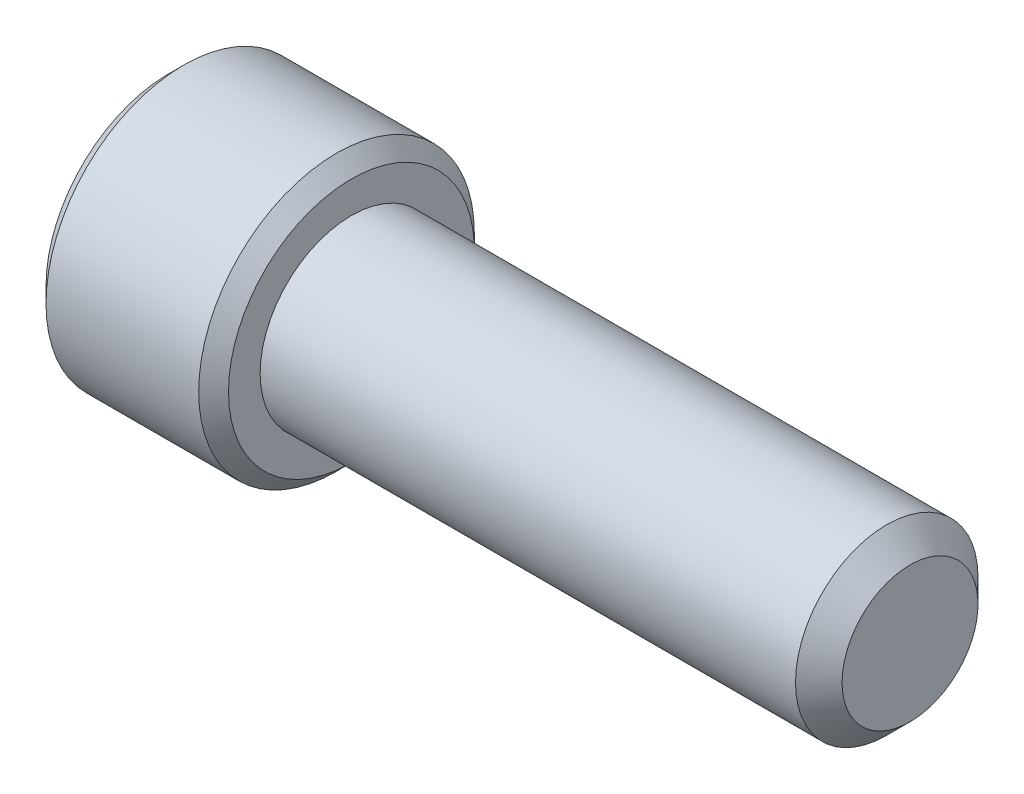
ISO-10303-21;
HEADER;
FILE_DESCRIPTION(('STEP AP214'),'2;1');
FILE_NAME('part.step','',(''),(''),'','','');
FILE_SCHEMA(('AUTOMOTIVE_DESIGN { 1 0 10303 214 1 1 1 1 }'));
ENDSEC;
DATA;
#1=APPLICATION_CONTEXT('core data for automotive mechanical design processes');
#2=APPLICATION_PROTOCOL_DEFINITION('international standard','automotive_design',2000,#1);
#3=PRODUCT_CONTEXT('',#1,'mechanical');
#4=PRODUCT('Part','Part','',(#3));
#5=PRODUCT_RELATED_PRODUCT_CATEGORY('part','',(#4));
#6=PRODUCT_DEFINITION_FORMATION('','',#4);
#7=PRODUCT_DEFINITION_CONTEXT('part definition',#1,'design');
#8=PRODUCT_DEFINITION('design','',#6,#7);
#9=PRODUCT_DEFINITION_SHAPE('','',#8);
#10=(LENGTH_UNIT() NAMED_UNIT(*) SI_UNIT(.MILLI.,.METRE.));
#11=(NAMED_UNIT(*) PLANE_ANGLE_UNIT() SI_UNIT($,.RADIAN.));
#12=(NAMED_UNIT(*) SI_UNIT($,.STERADIAN.) SOLID_ANGLE_UNIT());
#13=UNCERTAINTY_MEASURE_WITH_UNIT(LENGTH_MEASURE(1.E-05),#10,'distance_accuracy_value','');
#14=(GEOMETRIC_REPRESENTATION_CONTEXT(3) GLOBAL_UNCERTAINTY_ASSIGNED_CONTEXT((#13)) GLOBAL_UNIT_ASSIGNED_CONTEXT((#10,
#11,#12)) REPRESENTATION_CONTEXT('',''));
#15=CARTESIAN_POINT('',(0.,0.,0.));
#16=DIRECTION('',(0.,0.,1.));
#17=DIRECTION('',(1.,0.,0.));
#18=AXIS2_PLACEMENT_3D('',#15,#16,#17);
#19=CARTESIAN_POINT('',(12.6365,0.,0.));
#20=DIRECTION('',(-1.,0.,0.));
#21=DIRECTION('',(0.,0.,1.));
#22=AXIS2_PLACEMENT_3D('',#19,#20,#21);
#23=PLANE('',#22);
#24=CARTESIAN_POINT('',(12.6365,0.,0.));
#25=DIRECTION('',(-1.,0.,0.));
#26=DIRECTION('',(0.,0.,1.));
#27=AXIS2_PLACEMENT_3D('',#24,#25,#26);
#28=CIRCLE('',#27,2.31775000002391);
#29=CARTESIAN_POINT('',(12.6365,0.,2.31775000002391));
#30=VERTEX_POINT('',#29);
#31=EDGE_CURVE('E11',#30,#30,#28,.T.);
#32=ORIENTED_EDGE('',*,*,#31,.F.);
#33=EDGE_LOOP('',(#32));
#34=FACE_BOUND('',#33,.T.);
#35=ADVANCED_FACE('F30',(#34),#23,.F.);
#36=CARTESIAN_POINT('',(12.6365,0.,0.));
#37=DIRECTION('',(-1.,0.,0.));
#38=DIRECTION('',(0.,0.,1.));
#39=AXIS2_PLACEMENT_3D('',#36,#37,#38);
#40=CONICAL_SURFACE('',#39,2.31775000002391,0.785398163397443);
#41=CARTESIAN_POINT('',(11.8427500000239,0.,0.));
#42=DIRECTION('',(-1.,0.,0.));
#43=DIRECTION('',(0.,0.,1.));
#44=AXIS2_PLACEMENT_3D('',#41,#42,#43);
#45=CIRCLE('',#44,3.11150000000002);
#46=CARTESIAN_POINT('',(11.8427500000239,0.,3.11150000000002));
#47=VERTEX_POINT('',#46);
#48=EDGE_CURVE('E37',#47,#47,#45,.T.);
#49=ORIENTED_EDGE('',*,*,#48,.F.);
#50=EDGE_LOOP('',(#49));
#51=FACE_BOUND('',#50,.T.);
#52=ORIENTED_EDGE('',*,*,#31,.T.);
#53=EDGE_LOOP('',(#52));
#54=FACE_BOUND('',#53,.T.);
#55=ADVANCED_FACE('F155',(#51,#54),#40,.T.);
#56=CARTESIAN_POINT('',(-124.874669814116,0.,0.));
#57=DIRECTION('',(-1.,0.,0.));
#58=DIRECTION('',(0.,0.,1.));
#59=AXIS2_PLACEMENT_3D('',#56,#57,#58);
#60=CYLINDRICAL_SURFACE('',#59,3.11150000000001);
#61=CARTESIAN_POINT('',(-6.4135,0.,0.));
#62=DIRECTION('',(-1.,0.,0.));
#63=DIRECTION('',(0.,0.,1.));
#64=AXIS2_PLACEMENT_3D('',#61,#62,#63);
#65=CIRCLE('',#64,3.11150000000001);
#66=CARTESIAN_POINT('',(-6.4135,0.,3.11150000000001));
#67=VERTEX_POINT('',#66);
#68=EDGE_CURVE('E148',#67,#67,#65,.T.);
#69=ORIENTED_EDGE('',*,*,#68,.F.);
#70=EDGE_LOOP('',(#69));
#71=FACE_BOUND('',#70,.T.);
#72=ORIENTED_EDGE('',*,*,#48,.T.);
#73=EDGE_LOOP('',(#72));
#74=FACE_BOUND('',#73,.T.);
#75=ADVANCED_FACE('F153',(#71,#74),#60,.T.);
#76=CARTESIAN_POINT('',(-6.4135,3.11150000000001,0.));
#77=DIRECTION('',(-1.,0.,0.));
#78=DIRECTION('',(0.,0.,1.));
#79=AXIS2_PLACEMENT_3D('',#76,#77,#78);
#80=PLANE('',#79);
#81=CARTESIAN_POINT('',(-6.4135,0.,0.));
#82=DIRECTION('',(-1.,0.,0.));
#83=DIRECTION('',(0.,0.,1.));
#84=AXIS2_PLACEMENT_3D('',#81,#82,#83);
#85=CIRCLE('',#84,4.191);
#86=CARTESIAN_POINT('',(-6.4135,0.,4.191));
#87=VERTEX_POINT('',#86);
#88=EDGE_CURVE('E145',#87,#87,#85,.T.);
#89=ORIENTED_EDGE('',*,*,#88,.F.);
#90=EDGE_LOOP('',(#89));
#91=FACE_BOUND('',#90,.T.);
#92=ORIENTED_EDGE('',*,*,#68,.T.);
#93=EDGE_LOOP('',(#92));
#94=FACE_BOUND('',#93,.T.);
#95=ADVANCED_FACE('F173',(#91,#94),#80,.F.);
#96=CARTESIAN_POINT('',(-6.4135,0.,0.));
#97=DIRECTION('',(-1.,0.,0.));
#98=DIRECTION('',(0.,0.,1.));
#99=AXIS2_PLACEMENT_3D('',#96,#97,#98);
#100=CONICAL_SURFACE('',#99,4.191,0.785398163397453);
#101=CARTESIAN_POINT('',(-6.9215,0.,0.));
#102=DIRECTION('',(-1.,0.,0.));
#103=DIRECTION('',(0.,0.,1.));
#104=AXIS2_PLACEMENT_3D('',#101,#102,#103);
#105=CIRCLE('',#104,4.699);
#106=CARTESIAN_POINT('',(-6.9215,0.,4.699));
#107=VERTEX_POINT('',#106);
#108=EDGE_CURVE('E142',#107,#107,#105,.T.);
#109=ORIENTED_EDGE('',*,*,#108,.F.);
#110=EDGE_LOOP('',(#109));
#111=FACE_BOUND('',#110,.T.);
#112=ORIENTED_EDGE('',*,*,#88,.T.);
#113=EDGE_LOOP('',(#112));
#114=FACE_BOUND('',#113,.T.);
#115=ADVANCED_FACE('F181',(#111,#114),#100,.T.);
#116=CARTESIAN_POINT('',(-124.874669814116,0.,0.));
#117=DIRECTION('',(-1.,0.,0.));
#118=DIRECTION('',(0.,0.,1.));
#119=AXIS2_PLACEMENT_3D('',#116,#117,#118);
#120=CYLINDRICAL_SURFACE('',#119,4.699);
#121=CARTESIAN_POINT('',(-12.1285,0.,0.));
#122=DIRECTION('',(-1.,0.,0.));
#123=DIRECTION('',(0.,0.,1.));
#124=AXIS2_PLACEMENT_3D('',#121,#122,#123);
#125=CIRCLE('',#124,4.699);
#126=CARTESIAN_POINT('',(-12.1285,0.,4.699));
#127=VERTEX_POINT('',#126);
#128=EDGE_CURVE('E139',#127,#127,#125,.T.);
#129=ORIENTED_EDGE('',*,*,#128,.F.);
#130=EDGE_LOOP('',(#129));
#131=FACE_BOUND('',#130,.T.);
#132=ORIENTED_EDGE('',*,*,#108,.T.);
#133=EDGE_LOOP('',(#132));
#134=FACE_BOUND('',#133,.T.);
#135=ADVANCED_FACE('F189',(#131,#134),#120,.T.);
#136=CARTESIAN_POINT('',(-12.1285,0.,0.));
#137=DIRECTION('',(1.,0.,0.));
#138=DIRECTION('',(0.,0.,-1.));
#139=AXIS2_PLACEMENT_3D('',#136,#137,#138);
#140=CONICAL_SURFACE('',#139,4.699,0.785398163397438);
#141=CARTESIAN_POINT('',(-12.6365,0.,0.));
#142=DIRECTION('',(-1.,0.,0.));
#143=DIRECTION('',(0.,0.,1.));
#144=AXIS2_PLACEMENT_3D('',#141,#142,#143);
#145=CIRCLE('',#144,4.191);
#146=CARTESIAN_POINT('',(-12.6365,0.,4.191));
#147=VERTEX_POINT('',#146);
#148=EDGE_CURVE('E131',#147,#147,#145,.T.);
#149=ORIENTED_EDGE('',*,*,#148,.F.);
#150=EDGE_LOOP('',(#149));
#151=FACE_BOUND('',#150,.T.);
#152=ORIENTED_EDGE('',*,*,#128,.T.);
#153=EDGE_LOOP('',(#152));
#154=FACE_BOUND('',#153,.T.);
#155=ADVANCED_FACE('F197',(#151,#154),#140,.T.);
#156=CARTESIAN_POINT('',(-12.6365,4.191,0.));
#157=DIRECTION('',(1.,0.,0.));
#158=DIRECTION('',(0.,0.,-1.));
#159=AXIS2_PLACEMENT_3D('',#156,#157,#158);
#160=PLANE('',#159);
#161=DIRECTION('',(0.,-0.5,-0.866025403784439));
#162=VECTOR('',#161,1.);
#163=CARTESIAN_POINT('',(-12.6365,2.74963065701561,0.));
#164=LINE('',#163,#162);
#165=CARTESIAN_POINT('',(-12.6365,2.74963065701561,0.));
#166=VERTEX_POINT('',#165);
#167=CARTESIAN_POINT('',(-12.6365,1.37481532850786,-2.38124999999992));
#168=VERTEX_POINT('',#167);
#169=EDGE_CURVE('E118',#166,#168,#164,.T.);
#170=ORIENTED_EDGE('',*,*,#169,.F.);
#171=DIRECTION('',(0.,0.5,-0.866025403784439));
#172=VECTOR('',#171,1.);
#173=CARTESIAN_POINT('',(-12.6365,1.37481532850786,2.38124999999992));
#174=LINE('',#173,#172);
#175=CARTESIAN_POINT('',(-12.6365,1.37481532850786,2.38124999999992));
#176=VERTEX_POINT('',#175);
#177=EDGE_CURVE('E44',#176,#166,#174,.T.);
#178=ORIENTED_EDGE('',*,*,#177,.F.);
#179=DIRECTION('',(0.,1.,0.));
#180=VECTOR('',#179,1.);
#181=CARTESIAN_POINT('',(-12.6365,-1.37481532850786,2.38124999999992));
#182=LINE('',#181,#180);
#183=CARTESIAN_POINT('',(-12.6365,-1.37481532850786,2.38124999999992));
#184=VERTEX_POINT('',#183);
#185=EDGE_CURVE('E127',#184,#176,#182,.T.);
#186=ORIENTED_EDGE('',*,*,#185,.F.);
#187=DIRECTION('',(0.,0.5,0.866025403784439));
#188=VECTOR('',#187,1.);
#189=CARTESIAN_POINT('',(-12.6365,-2.74963065701561,0.));
#190=LINE('',#189,#188);
#191=CARTESIAN_POINT('',(-12.6365,-2.74963065701561,0.));
#192=VERTEX_POINT('',#191);
#193=EDGE_CURVE('E125',#192,#184,#190,.T.);
#194=ORIENTED_EDGE('',*,*,#193,.F.);
#195=DIRECTION('',(0.,-0.5,0.866025403784439));
#196=VECTOR('',#195,1.);
#197=CARTESIAN_POINT('',(-12.6365,-1.37481532850786,-2.38124999999992));
#198=LINE('',#197,#196);
#199=CARTESIAN_POINT('',(-12.6365,-1.37481532850786,-2.38124999999992));
#200=VERTEX_POINT('',#199);
#201=EDGE_CURVE('E92',#200,#192,#198,.T.);
#202=ORIENTED_EDGE('',*,*,#201,.F.);
#203=DIRECTION('',(0.,-1.,0.));
#204=VECTOR('',#203,1.);
#205=CARTESIAN_POINT('',(-12.6365,1.37481532850786,-2.38124999999992));
#206=LINE('',#205,#204);
#207=EDGE_CURVE('E121',#168,#200,#206,.T.);
#208=ORIENTED_EDGE('',*,*,#207,.F.);
#209=EDGE_LOOP('',(#170,#178,#186,#194,#202,#208));
#210=FACE_BOUND('',#209,.T.);
#211=ORIENTED_EDGE('',*,*,#148,.T.);
#212=EDGE_LOOP('',(#211));
#213=FACE_BOUND('',#212,.T.);
#214=ADVANCED_FACE('F205',(#210,#213),#160,.F.);
#215=CARTESIAN_POINT('',(-8.8265,1.37481532850786,2.38124999999992));
#216=DIRECTION('',(0.,0.866025403784439,0.5));
#217=DIRECTION('',(0.,-0.5,0.866025403784439));
#218=AXIS2_PLACEMENT_3D('',#215,#216,#217);
#219=PLANE('',#218);
#220=ORIENTED_EDGE('',*,*,#177,.T.);
#221=DIRECTION('',(-1.,0.,0.));
#222=VECTOR('',#221,1.);
#223=CARTESIAN_POINT('',(-8.8265,2.74963065701561,0.));
#224=LINE('',#223,#222);
#225=CARTESIAN_POINT('',(-8.8265,2.74963065701561,0.));
#226=VERTEX_POINT('',#225);
#227=EDGE_CURVE('E74',#226,#166,#224,.T.);
#228=ORIENTED_EDGE('',*,*,#227,.F.);
#229=DIRECTION('',(0.,0.5,-0.866025403784439));
#230=VECTOR('',#229,1.);
#231=CARTESIAN_POINT('',(-8.8265,1.37481532850786,2.38124999999992));
#232=LINE('',#231,#230);
#233=CARTESIAN_POINT('',(-8.8265,1.37481532850786,2.38124999999992));
#234=VERTEX_POINT('',#233);
#235=EDGE_CURVE('E129',#234,#226,#232,.T.);
#236=ORIENTED_EDGE('',*,*,#235,.F.);
#237=DIRECTION('',(-1.,0.,0.));
#238=VECTOR('',#237,1.);
#239=CARTESIAN_POINT('',(-8.8265,1.37481532850786,2.38124999999992));
#240=LINE('',#239,#238);
#241=EDGE_CURVE('E52',#234,#176,#240,.T.);
#242=ORIENTED_EDGE('',*,*,#241,.T.);
#243=EDGE_LOOP('',(#220,#228,#236,#242));
#244=FACE_BOUND('',#243,.T.);
#245=ADVANCED_FACE('F213',(#244),#219,.F.);
#246=CARTESIAN_POINT('',(-8.8265,-1.37481532850786,2.38124999999992));
#247=DIRECTION('',(0.,0.,1.));
#248=DIRECTION('',(1.,0.,0.));
#249=AXIS2_PLACEMENT_3D('',#246,#247,#248);
#250=PLANE('',#249);
#251=ORIENTED_EDGE('',*,*,#185,.T.);
#252=ORIENTED_EDGE('',*,*,#241,.F.);
#253=DIRECTION('',(0.,1.,0.));
#254=VECTOR('',#253,1.);
#255=CARTESIAN_POINT('',(-8.8265,-1.37481532850786,2.38124999999992));
#256=LINE('',#255,#254);
#257=CARTESIAN_POINT('',(-8.8265,-1.37481532850786,2.38124999999992));
#258=VERTEX_POINT('',#257);
#259=EDGE_CURVE('E104',#258,#234,#256,.T.);
#260=ORIENTED_EDGE('',*,*,#259,.F.);
#261=DIRECTION('',(-1.,0.,0.));
#262=VECTOR('',#261,1.);
#263=CARTESIAN_POINT('',(-8.8265,-1.37481532850786,2.38124999999992));
#264=LINE('',#263,#262);
#265=EDGE_CURVE('E96',#258,#184,#264,.T.);
#266=ORIENTED_EDGE('',*,*,#265,.T.);
#267=EDGE_LOOP('',(#251,#252,#260,#266));
#268=FACE_BOUND('',#267,.T.);
#269=ADVANCED_FACE('F221',(#268),#250,.F.);
#270=CARTESIAN_POINT('',(-8.8265,-2.74963065701561,0.));
#271=DIRECTION('',(0.,-0.866025403784439,0.5));
#272=DIRECTION('',(0.,-0.5,-0.866025403784439));
#273=AXIS2_PLACEMENT_3D('',#270,#271,#272);
#274=PLANE('',#273);
#275=ORIENTED_EDGE('',*,*,#193,.T.);
#276=ORIENTED_EDGE('',*,*,#265,.F.);
#277=DIRECTION('',(0.,0.5,0.866025403784439));
#278=VECTOR('',#277,1.);
#279=CARTESIAN_POINT('',(-8.8265,-2.74963065701561,0.));
#280=LINE('',#279,#278);
#281=CARTESIAN_POINT('',(-8.8265,-2.74963065701561,0.));
#282=VERTEX_POINT('',#281);
#283=EDGE_CURVE('E100',#282,#258,#280,.T.);
#284=ORIENTED_EDGE('',*,*,#283,.F.);
#285=DIRECTION('',(-1.,0.,0.));
#286=VECTOR('',#285,1.);
#287=CARTESIAN_POINT('',(-8.8265,-2.74963065701561,0.));
#288=LINE('',#287,#286);
#289=EDGE_CURVE('E85',#282,#192,#288,.T.);
#290=ORIENTED_EDGE('',*,*,#289,.T.);
#291=EDGE_LOOP('',(#275,#276,#284,#290));
#292=FACE_BOUND('',#291,.T.);
#293=ADVANCED_FACE('F101',(#292),#274,.F.);
#294=CARTESIAN_POINT('',(-8.8265,-1.37481532850786,-2.38124999999992));
#295=DIRECTION('',(0.,-0.866025403784439,-0.5));
#296=DIRECTION('',(0.,0.5,-0.866025403784439));
#297=AXIS2_PLACEMENT_3D('',#294,#295,#296);
#298=PLANE('',#297);
#299=ORIENTED_EDGE('',*,*,#201,.T.);
#300=ORIENTED_EDGE('',*,*,#289,.F.);
#301=DIRECTION('',(0.,-0.5,0.866025403784439));
#302=VECTOR('',#301,1.);
#303=CARTESIAN_POINT('',(-8.8265,-1.37481532850786,-2.38124999999992));
#304=LINE('',#303,#302);
#305=CARTESIAN_POINT('',(-8.8265,-1.37481532850786,-2.38124999999992));
#306=VERTEX_POINT('',#305);
#307=EDGE_CURVE('E89',#306,#282,#304,.T.);
#308=ORIENTED_EDGE('',*,*,#307,.F.);
#309=DIRECTION('',(-1.,0.,0.));
#310=VECTOR('',#309,1.);
#311=CARTESIAN_POINT('',(-8.8265,-1.37481532850786,-2.38124999999992));
#312=LINE('',#311,#310);
#313=EDGE_CURVE('E97',#306,#200,#312,.T.);
#314=ORIENTED_EDGE('',*,*,#313,.T.);
#315=EDGE_LOOP('',(#299,#300,#308,#314));
#316=FACE_BOUND('',#315,.T.);
#317=ADVANCED_FACE('F87',(#316),#298,.F.);
#318=CARTESIAN_POINT('',(-8.8265,1.37481532850786,-2.38124999999992));
#319=DIRECTION('',(0.,0.,-1.));
#320=DIRECTION('',(-1.,0.,0.));
#321=AXIS2_PLACEMENT_3D('',#318,#319,#320);
#322=PLANE('',#321);
#323=ORIENTED_EDGE('',*,*,#207,.T.);
#324=ORIENTED_EDGE('',*,*,#313,.F.);
#325=DIRECTION('',(0.,-1.,0.));
#326=VECTOR('',#325,1.);
#327=CARTESIAN_POINT('',(-8.8265,1.37481532850786,-2.38124999999992));
#328=LINE('',#327,#326);
#329=CARTESIAN_POINT('',(-8.8265,1.37481532850786,-2.38124999999992));
#330=VERTEX_POINT('',#329);
#331=EDGE_CURVE('E110',#330,#306,#328,.T.);
#332=ORIENTED_EDGE('',*,*,#331,.F.);
#333=DIRECTION('',(-1.,0.,0.));
#334=VECTOR('',#333,1.);
#335=CARTESIAN_POINT('',(-8.8265,1.37481532850786,-2.38124999999992));
#336=LINE('',#335,#334);
#337=EDGE_CURVE('E134',#330,#168,#336,.T.);
#338=ORIENTED_EDGE('',*,*,#337,.T.);
#339=EDGE_LOOP('',(#323,#324,#332,#338));
#340=FACE_BOUND('',#339,.T.);
#341=ADVANCED_FACE('F240',(#340),#322,.F.);
#342=CARTESIAN_POINT('',(-8.8265,2.74963065701561,0.));
#343=DIRECTION('',(0.,0.866025403784439,-0.5));
#344=DIRECTION('',(0.,0.5,0.866025403784439));
#345=AXIS2_PLACEMENT_3D('',#342,#343,#344);
#346=PLANE('',#345);
#347=ORIENTED_EDGE('',*,*,#169,.T.);
#348=ORIENTED_EDGE('',*,*,#337,.F.);
#349=DIRECTION('',(0.,-0.5,-0.866025403784439));
#350=VECTOR('',#349,1.);
#351=CARTESIAN_POINT('',(-8.8265,2.74963065701561,0.));
#352=LINE('',#351,#350);
#353=EDGE_CURVE('E112',#226,#330,#352,.T.);
#354=ORIENTED_EDGE('',*,*,#353,.F.);
#355=ORIENTED_EDGE('',*,*,#227,.T.);
#356=EDGE_LOOP('',(#347,#348,#354,#355));
#357=FACE_BOUND('',#356,.T.);
#358=ADVANCED_FACE('F247',(#357),#346,.F.);
#359=CARTESIAN_POINT('',(-8.8265,2.74963065701561,0.));
#360=DIRECTION('',(-1.,0.,0.));
#361=DIRECTION('',(0.,0.,1.));
#362=AXIS2_PLACEMENT_3D('',#359,#360,#361);
#363=PLANE('',#362);
#364=ORIENTED_EDGE('',*,*,#235,.T.);
#365=ORIENTED_EDGE('',*,*,#353,.T.);
#366=ORIENTED_EDGE('',*,*,#331,.T.);
#367=ORIENTED_EDGE('',*,*,#307,.T.);
#368=ORIENTED_EDGE('',*,*,#283,.T.);
#369=ORIENTED_EDGE('',*,*,#259,.T.);
#370=EDGE_LOOP('',(#364,#365,#366,#367,#368,#369));
#371=FACE_BOUND('',#370,.T.);
#372=ADVANCED_FACE('F107',(#371),#363,.T.);
#373=CLOSED_SHELL('',(#35,#55,#75,#95,#115,#135,#155,#214,#245,#269,#293,#317,#341,#358,#372));
#374=MANIFOLD_SOLID_BREP('B2',#373);
#375=ADVANCED_BREP_SHAPE_REPRESENTATION('',(#18,#374),#14);
#376=SHAPE_DEFINITION_REPRESENTATION(#9,#375);
ENDSEC;
END-ISO-10303-21;
